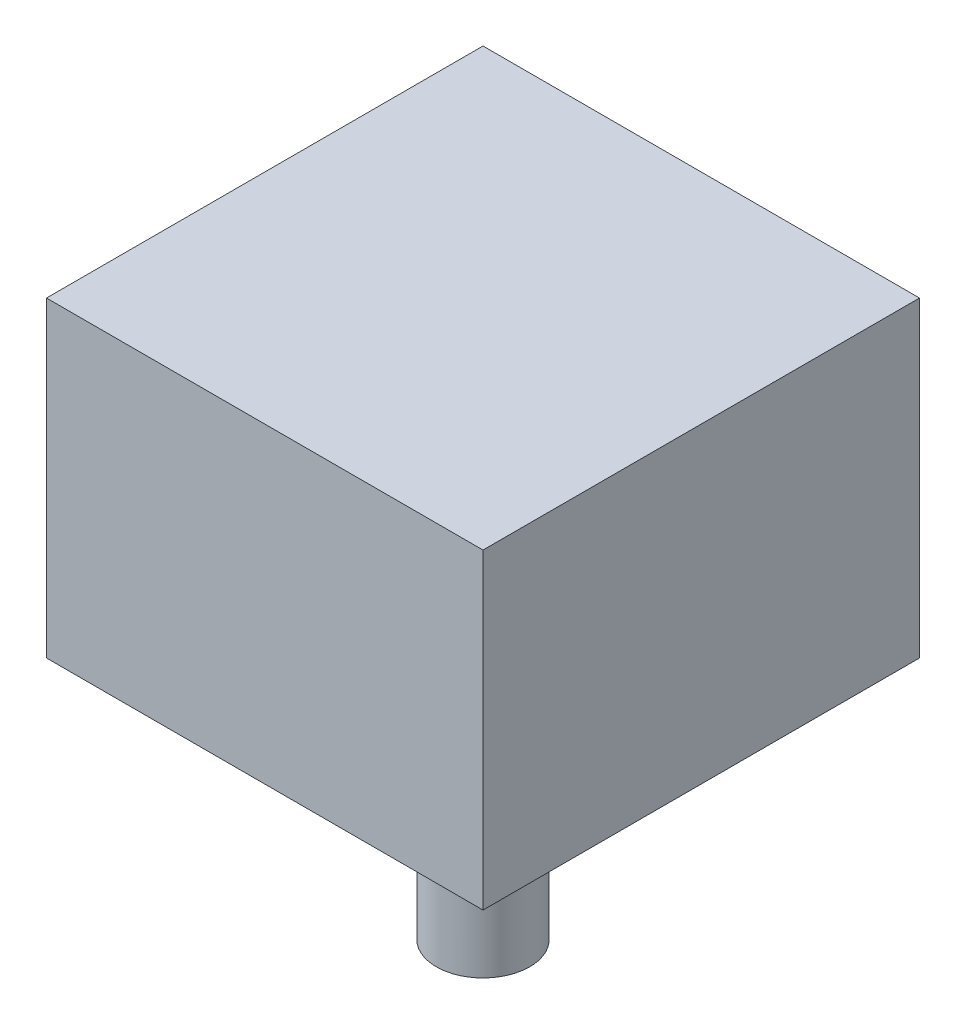
ISO-10303-21;
HEADER;
FILE_DESCRIPTION(('STEP AP214'),'2;1');
FILE_NAME('part.step','',(''),(''),'','','');
FILE_SCHEMA(('AUTOMOTIVE_DESIGN { 1 0 10303 214 1 1 1 1 }'));
ENDSEC;
DATA;
#1=APPLICATION_CONTEXT('core data for automotive mechanical design processes');
#2=APPLICATION_PROTOCOL_DEFINITION('international standard','automotive_design',2000,#1);
#3=PRODUCT_CONTEXT('',#1,'mechanical');
#4=PRODUCT('Part','Part','',(#3));
#5=PRODUCT_RELATED_PRODUCT_CATEGORY('part','',(#4));
#6=PRODUCT_DEFINITION_FORMATION('','',#4);
#7=PRODUCT_DEFINITION_CONTEXT('part definition',#1,'design');
#8=PRODUCT_DEFINITION('design','',#6,#7);
#9=PRODUCT_DEFINITION_SHAPE('','',#8);
#10=(LENGTH_UNIT() NAMED_UNIT(*) SI_UNIT(.MILLI.,.METRE.));
#11=(NAMED_UNIT(*) PLANE_ANGLE_UNIT() SI_UNIT($,.RADIAN.));
#12=(NAMED_UNIT(*) SI_UNIT($,.STERADIAN.) SOLID_ANGLE_UNIT());
#13=UNCERTAINTY_MEASURE_WITH_UNIT(LENGTH_MEASURE(1.E-05),#10,'distance_accuracy_value','');
#14=(GEOMETRIC_REPRESENTATION_CONTEXT(3) GLOBAL_UNCERTAINTY_ASSIGNED_CONTEXT((#13)) GLOBAL_UNIT_ASSIGNED_CONTEXT((#10,
#11,#12)) REPRESENTATION_CONTEXT('',''));
#15=CARTESIAN_POINT('',(0.,0.,0.));
#16=DIRECTION('',(0.,0.,1.));
#17=DIRECTION('',(1.,0.,0.));
#18=AXIS2_PLACEMENT_3D('',#15,#16,#17);
#19=CARTESIAN_POINT('',(0.,-8.,0.));
#20=DIRECTION('',(0.,-1.,0.));
#21=DIRECTION('',(1.,0.,0.));
#22=AXIS2_PLACEMENT_3D('',#19,#20,#21);
#23=SPHERICAL_SURFACE('',#22,6.4);
#24=CARTESIAN_POINT('',(0.,-13.653317610041,0.));
#25=DIRECTION('',(0.,-1.,0.));
#26=DIRECTION('',(0.,0.,-1.));
#27=AXIS2_PLACEMENT_3D('',#24,#25,#26);
#28=CIRCLE('',#27,3.);
#29=CARTESIAN_POINT('',(0.,-13.653317610041,-3.));
#30=VERTEX_POINT('',#29);
#31=EDGE_CURVE('E60',#30,#30,#28,.T.);
#32=ORIENTED_EDGE('',*,*,#31,.F.);
#33=EDGE_LOOP('',(#32));
#34=FACE_BOUND('',#33,.T.);
#35=ADVANCED_FACE('F48',(#34),#23,.T.);
#36=CARTESIAN_POINT('',(0.,-25.653317610041,0.));
#37=DIRECTION('',(0.,-1.,0.));
#38=DIRECTION('',(0.,0.,-1.));
#39=AXIS2_PLACEMENT_3D('',#36,#37,#38);
#40=PLANE('',#39);
#41=CARTESIAN_POINT('',(0.,-25.653317610041,0.));
#42=DIRECTION('',(0.,-1.,0.));
#43=DIRECTION('',(0.,0.,-1.));
#44=AXIS2_PLACEMENT_3D('',#41,#42,#43);
#45=CIRCLE('',#44,3.);
#46=CARTESIAN_POINT('',(0.,-25.653317610041,-3.));
#47=VERTEX_POINT('',#46);
#48=EDGE_CURVE('E11',#47,#47,#45,.T.);
#49=ORIENTED_EDGE('',*,*,#48,.T.);
#50=EDGE_LOOP('',(#49));
#51=FACE_BOUND('',#50,.T.);
#52=ADVANCED_FACE('F82',(#51),#40,.T.);
#53=CARTESIAN_POINT('',(0.,-15.,0.));
#54=DIRECTION('',(0.,-1.,0.));
#55=DIRECTION('',(0.,0.,-1.));
#56=AXIS2_PLACEMENT_3D('',#53,#54,#55);
#57=CYLINDRICAL_SURFACE('',#56,3.);
#58=CARTESIAN_POINT('',(0.,-16.103317610041,-3.));
#59=CARTESIAN_POINT('',(0.0811571910938377,-16.103322868141,-2.99999537089788));
#60=CARTESIAN_POINT('',(0.16240120517588,-16.1097289395545,-2.99667198613769));
#61=CARTESIAN_POINT('',(0.322467237501783,-16.1350599971728,-2.98370448048951));
#62=CARTESIAN_POINT('',(0.401284825199774,-16.1540066096197,-2.9740494408884));
#63=CARTESIAN_POINT('',(0.553942541484701,-16.2034692765506,-2.94942426610681));
#64=CARTESIAN_POINT('',(0.627801076270518,-16.233939403429,-2.9344752452331));
#65=CARTESIAN_POINT('',(0.769236589542657,-16.3053350234405,-2.90061565038481));
#66=CARTESIAN_POINT('',(0.836813795276095,-16.3462601381301,-2.88170521980747));
#67=CARTESIAN_POINT('',(0.968580906882855,-16.4403404079851,-2.84023220948414));
#68=CARTESIAN_POINT('',(1.03228532788197,-16.4941059159741,-2.81751418971712));
#69=CARTESIAN_POINT('',(1.15022482176075,-16.6110185822633,-2.77146151785461));
#70=CARTESIAN_POINT('',(1.20445215024937,-16.6741733359045,-2.74812637922862));
#71=CARTESIAN_POINT('',(1.30648923081014,-16.8144349240809,-2.70120330313405));
#72=CARTESIAN_POINT('',(1.35337394091069,-16.8922688283617,-2.67775957207618));
#73=CARTESIAN_POINT('',(1.43319211235935,-17.0560403432439,-2.63590673492171));
#74=CARTESIAN_POINT('',(1.4661359906984,-17.1419718441713,-2.61749387327315));
#75=CARTESIAN_POINT('',(1.51491639840249,-17.3141578461869,-2.58955215608188));
#76=CARTESIAN_POINT('',(1.53167906402741,-17.4000686049195,-2.57954726765548));
#77=CARTESIAN_POINT('',(1.5504322336963,-17.5740158801543,-2.56832510020633));
#78=CARTESIAN_POINT('',(1.55243922221982,-17.6620499142261,-2.56709801499814));
#79=CARTESIAN_POINT('',(1.54230129742961,-17.8254323219932,-2.57319253317738));
#80=CARTESIAN_POINT('',(1.53196008446953,-17.9009436477359,-2.57942483011358));
#81=CARTESIAN_POINT('',(1.50056578834274,-18.048954218708,-2.59781254539799));
#82=CARTESIAN_POINT('',(1.47950888000057,-18.1214523783261,-2.6099700788088));
#83=CARTESIAN_POINT('',(1.42692348053688,-18.2634472610811,-2.63909184292093));
#84=CARTESIAN_POINT('',(1.39516499725198,-18.3328364096341,-2.65616032364527));
#85=CARTESIAN_POINT('',(1.32226003328843,-18.4656437114367,-2.6931948900567));
#86=CARTESIAN_POINT('',(1.28110933978834,-18.5290591671334,-2.71316227456326));
#87=CARTESIAN_POINT('',(1.18404201316546,-18.6572393494268,-2.75703642460624));
#88=CARTESIAN_POINT('',(1.12687615066993,-18.7210048286204,-2.78110870294602));
#89=CARTESIAN_POINT('',(1.00260342432817,-18.8384767561711,-2.8282866964176));
#90=CARTESIAN_POINT('',(0.935491212511122,-18.892177757646,-2.85139188293745));
#91=CARTESIAN_POINT('',(0.788777791303168,-18.9906787708916,-2.89551258123171));
#92=CARTESIAN_POINT('',(0.708704849471569,-19.0348606853737,-2.91635383715829));
#93=CARTESIAN_POINT('',(0.540916699103983,-19.1087528594745,-2.95207406352636));
#94=CARTESIAN_POINT('',(0.453208011588538,-19.1384753274437,-2.96695806189017));
#95=CARTESIAN_POINT('',(0.280760113824296,-19.1800288551139,-2.98798539660305));
#96=CARTESIAN_POINT('',(0.196419524160747,-19.193184317482,-2.99477304114119));
#97=CARTESIAN_POINT('',(0.0264689022377674,-19.2054277394938,-3.0010855932881));
#98=CARTESIAN_POINT('',(-0.0591404421617319,-19.2045230618676,-3.00061430211088));
#99=CARTESIAN_POINT('',(-0.221539739201024,-19.1893873291257,-2.9928209898369));
#100=CARTESIAN_POINT('',(-0.298466661716923,-19.176281587065,-2.98607750557626));
#101=CARTESIAN_POINT('',(-0.448859357796647,-19.1389253574439,-2.96719922421109));
#102=CARTESIAN_POINT('',(-0.52232475993346,-19.1146736768943,-2.95506384999814));
#103=CARTESIAN_POINT('',(-0.666024635549229,-19.0551468665829,-2.92607802762268));
#104=CARTESIAN_POINT('',(-0.736118511927177,-19.0195920454011,-2.90910922874944));
#105=CARTESIAN_POINT('',(-0.869563703611751,-18.9387944126471,-2.87204849519176));
#106=CARTESIAN_POINT('',(-0.9329122337994,-18.893547622354,-2.85195527881111));
#107=CARTESIAN_POINT('',(-1.05800428540772,-18.7892852152656,-2.80810596771983));
#108=CARTESIAN_POINT('',(-1.11890926475951,-18.7293310803752,-2.78418580334275));
#109=CARTESIAN_POINT('',(-1.23019970538266,-18.6000960362657,-2.73683648190065));
#110=CARTESIAN_POINT('',(-1.28057666580067,-18.5308076637797,-2.71340773525694));
#111=CARTESIAN_POINT('',(-1.37215429643325,-18.3798980785479,-2.66832311402417));
#112=CARTESIAN_POINT('',(-1.41266019174362,-18.297796643362,-2.64684681378419));
#113=CARTESIAN_POINT('',(-1.4788525492711,-18.1264942199134,-2.61044850074907));
#114=CARTESIAN_POINT('',(-1.50455924389598,-18.0373031150279,-2.59551754632325));
#115=CARTESIAN_POINT('',(-1.53795658358956,-17.8636214412721,-2.57585561622635));
#116=CARTESIAN_POINT('',(-1.54716011229659,-17.7795211198746,-2.57027169154));
#117=CARTESIAN_POINT('',(-1.55170937850173,-17.6108272419549,-2.56753016065378));
#118=CARTESIAN_POINT('',(-1.54706263561229,-17.5262339779527,-2.57036798210188));
#119=CARTESIAN_POINT('',(-1.52547998823504,-17.3686237400016,-2.58322181370144));
#120=CARTESIAN_POINT('',(-1.50992456690369,-17.295342746505,-2.59243003353327));
#121=CARTESIAN_POINT('',(-1.46875628196533,-17.1525373265226,-2.61597283092195));
#122=CARTESIAN_POINT('',(-1.4431399785158,-17.0830141941182,-2.63030916164385));
#123=CARTESIAN_POINT('',(-1.38069574346861,-16.9445682389823,-2.66364552397914));
#124=CARTESIAN_POINT('',(-1.34323674576593,-16.8759912418904,-2.68289185984041));
#125=CARTESIAN_POINT('',(-1.25883212591263,-16.7456402412296,-2.72351522679164));
#126=CARTESIAN_POINT('',(-1.21188143318073,-16.6838699012284,-2.7448933936258));
#127=CARTESIAN_POINT('',(-1.10252915226198,-16.5603374638484,-2.79076888465928));
#128=CARTESIAN_POINT('',(-1.03890355388211,-16.499666638678,-2.81530328538766));
#129=CARTESIAN_POINT('',(-0.901768578594902,-16.3895750114482,-2.86217781867697));
#130=CARTESIAN_POINT('',(-0.828253434745607,-16.3401608191545,-2.88451665767506));
#131=CARTESIAN_POINT('',(-0.671719725833228,-16.2535272476479,-2.9249654101906));
#132=CARTESIAN_POINT('',(-0.588575023094196,-16.216502147391,-2.94300677813279));
#133=CARTESIAN_POINT('',(-0.416117662102291,-16.1574563372562,-2.9722779049624));
#134=CARTESIAN_POINT('',(-0.326822800067342,-16.1353941863057,-2.9835264675003));
#135=CARTESIAN_POINT('',(-0.197111591221045,-16.1153928502172,-2.99377574755927));
#136=CARTESIAN_POINT('',(-0.157869893981269,-16.110872027934,-2.99610282114016));
#137=CARTESIAN_POINT('',(-0.0790923446110308,-16.1048330898228,-2.99921609427244));
#138=CARTESIAN_POINT('',(-0.0395564853315007,-16.1033150472126,-3.00000225625121));
#139=CARTESIAN_POINT('',(0.,-16.103317610041,-3.));
#140=B_SPLINE_CURVE_WITH_KNOTS('',3,(#58,#59,#60,#61,#62,#63,#64,#65,#66,#67,#68,#69,#70,#71,
#72,#73,#74,#75,#76,#77,#78,#79,#80,#81,#82,#83,#84,#85,#86,#87,#88,#89,#90,#91,#92,#93,#94,#95,
#96,#97,#98,#99,#100,#101,#102,#103,#104,#105,#106,#107,#108,#109,#110,#111,#112,#113,#114,#115,
#116,#117,#118,#119,#120,#121,#122,#123,#124,#125,#126,#127,#128,#129,#130,#131,#132,#133,#134,
#135,#136,#137,#138,#139),.UNSPECIFIED.,.T.,.F.,(4,2,2,2,2,2,2,2,2,2,2,2,2,2,2,2,2,2,2,2,2,2,2,
2,2,2,2,2,2,2,2,2,2,2,2,2,2,2,2,2,4),(0.,0.243311545013475,0.487043779368091,0.729814671205952,
0.972576776611061,1.23071170610758,1.48905659919067,1.76915795006661,2.04904962997784,
2.31175720064009,2.57417123976732,2.80251243731576,3.03093520292359,3.26461853987062,
3.49840690083491,3.76413445854403,4.03000541498387,4.30988543134837,4.58952872847072,
4.84500071457372,5.10033892477694,5.33423793340262,5.56816198289844,5.80839566718477,
6.0487281612101,6.31383394548568,6.57915296946552,6.8597381050212,7.13993872810776,
7.39280485418765,7.64553371878147,7.87098585035563,8.09651513181351,8.33700671665397,
8.57762711619527,8.85021371423122,9.12295996177135,9.39980216012753,9.6758744563321,
9.79446302206795,9.91305447935708),.UNSPECIFIED.);
#141=CARTESIAN_POINT('',(0.,-16.103317610041,-3.));
#142=VERTEX_POINT('',#141);
#143=EDGE_CURVE('E51',#142,#142,#140,.T.);
#144=ORIENTED_EDGE('',*,*,#143,.F.);
#145=EDGE_LOOP('',(#144));
#146=FACE_BOUND('',#145,.T.);
#147=CARTESIAN_POINT('',(1.55,-17.653317610041,2.56855990780827));
#148=CARTESIAN_POINT('',(1.54999407109245,-17.5729772673291,2.56856758763115));
#149=CARTESIAN_POINT('',(1.54371135922679,-17.4925452104246,2.57238737620073));
#150=CARTESIAN_POINT('',(1.51891671673704,-17.3341844313511,2.58709992521849));
#151=CARTESIAN_POINT('',(1.50038081787188,-17.2562609300432,2.59800654738096));
#152=CARTESIAN_POINT('',(1.45211552860033,-17.1055116039471,2.62528412383222));
#153=CARTESIAN_POINT('',(1.42244885556849,-17.0326598789221,2.64162440408012));
#154=CARTESIAN_POINT('',(1.35295628441986,-16.8929879004758,2.67787992722966));
#155=CARTESIAN_POINT('',(1.31312926854181,-16.8261683117585,2.69779556339244));
#156=CARTESIAN_POINT('',(1.22032197800243,-16.693941959088,2.74110531727558));
#157=CARTESIAN_POINT('',(1.16649013086066,-16.6291823735859,2.76465130044681));
#158=CARTESIAN_POINT('',(1.04896817557422,-16.5091022068992,2.81134587456851));
#159=CARTESIAN_POINT('',(0.985272888962598,-16.4537866162262,2.83449424963512));
#160=CARTESIAN_POINT('',(0.844142015762803,-16.3501943394916,2.87980949206863));
#161=CARTESIAN_POINT('',(0.766042002654875,-16.3027290596355,2.90178054660839));
#162=CARTESIAN_POINT('',(0.601616567282121,-16.2219086663453,2.94026618916116));
#163=CARTESIAN_POINT('',(0.515296729940618,-16.1885440549167,2.95678444844664));
#164=CARTESIAN_POINT('',(0.343751425344186,-16.1394866583178,2.98140398435746));
#165=CARTESIAN_POINT('',(0.258930938090316,-16.1226545519336,2.99004437442712));
#166=CARTESIAN_POINT('',(0.0872652452120798,-16.1033722511965,2.99995965106026));
#167=CARTESIAN_POINT('',(0.00042139864906458,-16.1009126675754,3.00123934620302));
#168=CARTESIAN_POINT('',(-0.164194325558729,-16.1100415859951,2.99653017783555));
#169=CARTESIAN_POINT('',(-0.242060863657692,-16.1203488954343,2.99120414963753));
#170=CARTESIAN_POINT('',(-0.39477526047954,-16.152404363986,2.97490343836279));
#171=CARTESIAN_POINT('',(-0.469622891353697,-16.1741533849161,2.96392832978495));
#172=CARTESIAN_POINT('',(-0.615423392470293,-16.2285748655874,2.93714577929528));
#173=CARTESIAN_POINT('',(-0.686312903663804,-16.2613857925872,2.92127731120307));
#174=CARTESIAN_POINT('',(-0.821742168129232,-16.3367867815092,2.88611193920134));
#175=CARTESIAN_POINT('',(-0.886279697925966,-16.3793802504858,2.86681384135456));
#176=CARTESIAN_POINT('',(-1.01400407671659,-16.4779735073766,2.82431625347965));
#177=CARTESIAN_POINT('',(-1.07642304241976,-16.5348836363444,2.80091965725316));
#178=CARTESIAN_POINT('',(-1.19125978704577,-16.6580783362283,2.75404340345798));
#179=CARTESIAN_POINT('',(-1.24366896925665,-16.7243708807514,2.73056369197504));
#180=CARTESIAN_POINT('',(-1.34067598541859,-16.8701905100716,2.68433935057199));
#181=CARTESIAN_POINT('',(-1.38445282790692,-16.9503236137333,2.66176585737562));
#182=CARTESIAN_POINT('',(-1.45758159270671,-17.1182322887511,2.62244082990642));
#183=CARTESIAN_POINT('',(-1.48694930991728,-17.2059993670958,2.60568292666568));
#184=CARTESIAN_POINT('',(-1.52796614090751,-17.3792889104685,2.58182970365164));
#185=CARTESIAN_POINT('',(-1.54085224706871,-17.46442243988,2.57406462933597));
#186=CARTESIAN_POINT('',(-1.55227925919939,-17.6359665465933,2.56719372521464));
#187=CARTESIAN_POINT('',(-1.55083201076113,-17.7223760104494,2.56808074500257));
#188=CARTESIAN_POINT('',(-1.53476867977678,-17.8828750100118,2.57770145969976));
#189=CARTESIAN_POINT('',(-1.5217622123245,-17.9571933036838,2.58547570331481));
#190=CARTESIAN_POINT('',(-1.4853972952245,-18.1024304275551,2.60653659420377));
#191=CARTESIAN_POINT('',(-1.46203517760044,-18.1733480433607,2.61982519455895));
#192=CARTESIAN_POINT('',(-1.40452444849724,-18.313476874366,2.65111755303424));
#193=CARTESIAN_POINT('',(-1.36993220782627,-18.3824624900824,2.66930882951019));
#194=CARTESIAN_POINT('',(-1.29132141669978,-18.5140561069428,2.7082118952703));
#195=CARTESIAN_POINT('',(-1.24729801391975,-18.5766608005461,2.72892497964523));
#196=CARTESIAN_POINT('',(-1.14406942423122,-18.7026551644934,2.77392991563014));
#197=CARTESIAN_POINT('',(-1.08361254709366,-18.76498741218,2.79832457859212));
#198=CARTESIAN_POINT('',(-0.952771318472118,-18.8789840595197,2.84553409763735));
#199=CARTESIAN_POINT('',(-0.882382884381673,-18.9306440504555,2.86834829825402));
#200=CARTESIAN_POINT('',(-0.730528288923955,-19.0233531867568,2.91079728556098));
#201=CARTESIAN_POINT('',(-0.648769911698114,-19.0639886601364,2.93029988061539));
#202=CARTESIAN_POINT('',(-0.478280121236612,-19.1305105212262,2.96289604969122));
#203=CARTESIAN_POINT('',(-0.389555315148682,-19.1564106965126,2.97599561330176));
#204=CARTESIAN_POINT('',(-0.216791982566539,-19.1903593970293,2.99329389211888));
#205=CARTESIAN_POINT('',(-0.13311492049112,-19.1998763405463,2.99822306876511));
#206=CARTESIAN_POINT('',(0.0347780939831528,-19.2051987893894,3.00097103355683));
#207=CARTESIAN_POINT('',(0.118993816573317,-19.201009797313,2.99879267520451));
#208=CARTESIAN_POINT('',(0.279050183963372,-19.1799704377466,2.98799243472545));
#209=CARTESIAN_POINT('',(0.355052230531946,-19.1640706882262,2.97985458335338));
#210=CARTESIAN_POINT('',(0.503165342164941,-19.1214003109292,2.95845010729966));
#211=CARTESIAN_POINT('',(0.575275881921464,-19.0946282196513,2.94518279216408));
#212=CARTESIAN_POINT('',(0.716866547546158,-19.0298745932894,2.91403017134419));
#213=CARTESIAN_POINT('',(0.7861213167482,-18.9914824068124,2.89597937073075));
#214=CARTESIAN_POINT('',(0.91747704147612,-18.9050857544384,2.85708525970917));
#215=CARTESIAN_POINT('',(0.979574760181063,-18.8570769660376,2.83624069494933));
#216=CARTESIAN_POINT('',(1.10175313447835,-18.7469789266154,2.79120242805909));
#217=CARTESIAN_POINT('',(1.16093514660659,-18.6839399345929,2.76688703009447));
#218=CARTESIAN_POINT('',(1.26825247015974,-18.5485840487987,2.71937285599714));
#219=CARTESIAN_POINT('',(1.31637683220899,-18.4762580684726,2.6961752044712));
#220=CARTESIAN_POINT('',(1.40202611396712,-18.3204439373879,2.65268352260283));
#221=CARTESIAN_POINT('',(1.439016674449,-18.2366130752885,2.6325537877284));
#222=CARTESIAN_POINT('',(1.49779119293291,-18.0625743606906,2.59957382501019));
#223=CARTESIAN_POINT('',(1.51962562830278,-17.9723887888848,2.5866994604253));
#224=CARTESIAN_POINT('',(1.53880267262315,-17.8431514371448,2.57528987108191));
#225=CARTESIAN_POINT('',(1.54299409011397,-17.8053588234053,2.57277665675291));
#226=CARTESIAN_POINT('',(1.54859424707795,-17.729490229091,2.56940980204655));
#227=CARTESIAN_POINT('',(1.55000281143116,-17.6914142308347,2.56855626610983));
#228=CARTESIAN_POINT('',(1.55,-17.653317610041,2.56855990780827));
#229=B_SPLINE_CURVE_WITH_KNOTS('',3,(#147,#148,#149,#150,#151,#152,#153,#154,#155,#156,#157,
#158,#159,#160,#161,#162,#163,#164,#165,#166,#167,#168,#169,#170,#171,#172,#173,#174,#175,#176,
#177,#178,#179,#180,#181,#182,#183,#184,#185,#186,#187,#188,#189,#190,#191,#192,#193,#194,#195,
#196,#197,#198,#199,#200,#201,#202,#203,#204,#205,#206,#207,#208,#209,#210,#211,#212,#213,#214,
#215,#216,#217,#218,#219,#220,#221,#222,#223,#224,#225,#226,#227,#228),.UNSPECIFIED.,.T.,.F.,(4,
2,2,2,2,2,2,2,2,2,2,2,2,2,2,2,2,2,2,2,2,2,2,2,2,2,2,2,2,2,2,2,2,2,2,2,2,2,2,2,4),(0.,
0.240860404934378,0.48219335230399,0.722186424528839,0.962205910303522,1.2234452790249,
1.48482227062786,1.76532798576229,2.04564445422735,2.30490154317004,2.56398924593493,
2.7990581657298,3.03414479402262,3.27229068379531,3.51051964090497,3.7723607934912,
4.03442582200953,4.31513509274971,4.59553596615625,4.85334395290183,5.11093889578024,
5.33746018243238,5.56406176722676,5.80100537313768,6.03807118035938,6.30746891746102,
6.57697772141108,6.8555195369389,7.13380029500913,7.38550951502228,7.63711769235047,
7.87028238079253,8.1034784654127,8.34613400201953,8.58889885402428,8.85718985782794,
9.12574539156814,9.40565889084488,9.68463560847094,9.79884211828697,9.91305581468468),.UNSPECIFIED.);
#230=CARTESIAN_POINT('',(1.55,-17.653317610041,2.56855990780827));
#231=VERTEX_POINT('',#230);
#232=EDGE_CURVE('E66',#231,#231,#229,.T.);
#233=ORIENTED_EDGE('',*,*,#232,.F.);
#234=EDGE_LOOP('',(#233));
#235=FACE_BOUND('',#234,.T.);
#236=ORIENTED_EDGE('',*,*,#31,.T.);
#237=EDGE_LOOP('',(#236));
#238=FACE_BOUND('',#237,.T.);
#239=ORIENTED_EDGE('',*,*,#48,.F.);
#240=EDGE_LOOP('',(#239));
#241=FACE_BOUND('',#240,.T.);
#242=ADVANCED_FACE('F71',(#146,#235,#238,#241),#57,.T.);
#243=CARTESIAN_POINT('',(0.,-17.653317610041,-14.));
#244=DIRECTION('',(0.,0.,1.));
#245=DIRECTION('',(1.,0.,0.));
#246=AXIS2_PLACEMENT_3D('',#243,#244,#245);
#247=CYLINDRICAL_SURFACE('',#246,1.55);
#248=ORIENTED_EDGE('',*,*,#143,.T.);
#249=EDGE_LOOP('',(#248));
#250=FACE_BOUND('',#249,.T.);
#251=ORIENTED_EDGE('',*,*,#232,.T.);
#252=EDGE_LOOP('',(#251));
#253=FACE_BOUND('',#252,.T.);
#254=ADVANCED_FACE('F73',(#250,#253),#247,.F.);
#255=CLOSED_SHELL('',(#35,#52,#242,#254));
#256=MANIFOLD_SOLID_BREP('B2',#255);
#257=CARTESIAN_POINT('',(-14.,-10.,-14.));
#258=DIRECTION('',(-1.,0.,0.));
#259=DIRECTION('',(0.,0.,1.));
#260=AXIS2_PLACEMENT_3D('',#257,#258,#259);
#261=PLANE('',#260);
#262=DIRECTION('',(0.,0.,1.));
#263=VECTOR('',#262,1.);
#264=CARTESIAN_POINT('',(-14.,10.,-14.));
#265=LINE('',#264,#263);
#266=CARTESIAN_POINT('',(-14.,10.,-14.));
#267=VERTEX_POINT('',#266);
#268=CARTESIAN_POINT('',(-14.,10.,14.));
#269=VERTEX_POINT('',#268);
#270=EDGE_CURVE('E192',#267,#269,#265,.T.);
#271=ORIENTED_EDGE('',*,*,#270,.F.);
#272=DIRECTION('',(0.,1.,0.));
#273=VECTOR('',#272,1.);
#274=CARTESIAN_POINT('',(-14.,-10.,-14.));
#275=LINE('',#274,#273);
#276=CARTESIAN_POINT('',(-14.,-10.,-14.));
#277=VERTEX_POINT('',#276);
#278=EDGE_CURVE('E46',#277,#267,#275,.T.);
#279=ORIENTED_EDGE('',*,*,#278,.F.);
#280=DIRECTION('',(0.,0.,1.));
#281=VECTOR('',#280,1.);
#282=CARTESIAN_POINT('',(-14.,-10.,-14.));
#283=LINE('',#282,#281);
#284=CARTESIAN_POINT('',(-14.,-10.,14.));
#285=VERTEX_POINT('',#284);
#286=EDGE_CURVE('E185',#277,#285,#283,.T.);
#287=ORIENTED_EDGE('',*,*,#286,.T.);
#288=DIRECTION('',(0.,1.,0.));
#289=VECTOR('',#288,1.);
#290=CARTESIAN_POINT('',(-14.,-10.,14.));
#291=LINE('',#290,#289);
#292=EDGE_CURVE('E161',#285,#269,#291,.T.);
#293=ORIENTED_EDGE('',*,*,#292,.T.);
#294=EDGE_LOOP('',(#271,#279,#287,#293));
#295=FACE_BOUND('',#294,.T.);
#296=ADVANCED_FACE('F119',(#295),#261,.T.);
#297=CARTESIAN_POINT('',(-14.,-10.,-14.));
#298=DIRECTION('',(0.,0.,1.));
#299=DIRECTION('',(1.,0.,0.));
#300=AXIS2_PLACEMENT_3D('',#297,#298,#299);
#301=PLANE('',#300);
#302=DIRECTION('',(1.,0.,0.));
#303=VECTOR('',#302,1.);
#304=CARTESIAN_POINT('',(-14.,10.,-14.));
#305=LINE('',#304,#303);
#306=CARTESIAN_POINT('',(14.,10.,-14.));
#307=VERTEX_POINT('',#306);
#308=EDGE_CURVE('E153',#267,#307,#305,.T.);
#309=ORIENTED_EDGE('',*,*,#308,.T.);
#310=DIRECTION('',(0.,1.,0.));
#311=VECTOR('',#310,1.);
#312=CARTESIAN_POINT('',(14.,-10.,-14.));
#313=LINE('',#312,#311);
#314=CARTESIAN_POINT('',(14.,-10.,-14.));
#315=VERTEX_POINT('',#314);
#316=EDGE_CURVE('E129',#315,#307,#313,.T.);
#317=ORIENTED_EDGE('',*,*,#316,.F.);
#318=DIRECTION('',(1.,0.,0.));
#319=VECTOR('',#318,1.);
#320=CARTESIAN_POINT('',(-14.,-10.,-14.));
#321=LINE('',#320,#319);
#322=EDGE_CURVE('E171',#277,#315,#321,.T.);
#323=ORIENTED_EDGE('',*,*,#322,.F.);
#324=ORIENTED_EDGE('',*,*,#278,.T.);
#325=EDGE_LOOP('',(#309,#317,#323,#324));
#326=FACE_BOUND('',#325,.T.);
#327=ADVANCED_FACE('F220',(#326),#301,.F.);
#328=CARTESIAN_POINT('',(14.,-10.,-14.));
#329=DIRECTION('',(-1.,0.,0.));
#330=DIRECTION('',(0.,0.,1.));
#331=AXIS2_PLACEMENT_3D('',#328,#329,#330);
#332=PLANE('',#331);
#333=DIRECTION('',(0.,0.,1.));
#334=VECTOR('',#333,1.);
#335=CARTESIAN_POINT('',(14.,10.,-14.));
#336=LINE('',#335,#334);
#337=CARTESIAN_POINT('',(14.,10.,14.));
#338=VERTEX_POINT('',#337);
#339=EDGE_CURVE('E179',#307,#338,#336,.T.);
#340=ORIENTED_EDGE('',*,*,#339,.T.);
#341=DIRECTION('',(0.,1.,0.));
#342=VECTOR('',#341,1.);
#343=CARTESIAN_POINT('',(14.,-10.,14.));
#344=LINE('',#343,#342);
#345=CARTESIAN_POINT('',(14.,-10.,14.));
#346=VERTEX_POINT('',#345);
#347=EDGE_CURVE('E176',#346,#338,#344,.T.);
#348=ORIENTED_EDGE('',*,*,#347,.F.);
#349=DIRECTION('',(0.,0.,1.));
#350=VECTOR('',#349,1.);
#351=CARTESIAN_POINT('',(14.,-10.,-14.));
#352=LINE('',#351,#350);
#353=EDGE_CURVE('E166',#315,#346,#352,.T.);
#354=ORIENTED_EDGE('',*,*,#353,.F.);
#355=ORIENTED_EDGE('',*,*,#316,.T.);
#356=EDGE_LOOP('',(#340,#348,#354,#355));
#357=FACE_BOUND('',#356,.T.);
#358=ADVANCED_FACE('F177',(#357),#332,.F.);
#359=CARTESIAN_POINT('',(-14.,-10.,14.));
#360=DIRECTION('',(0.,0.,1.));
#361=DIRECTION('',(1.,0.,0.));
#362=AXIS2_PLACEMENT_3D('',#359,#360,#361);
#363=PLANE('',#362);
#364=DIRECTION('',(1.,0.,0.));
#365=VECTOR('',#364,1.);
#366=CARTESIAN_POINT('',(-14.,10.,14.));
#367=LINE('',#366,#365);
#368=EDGE_CURVE('E196',#269,#338,#367,.T.);
#369=ORIENTED_EDGE('',*,*,#368,.F.);
#370=ORIENTED_EDGE('',*,*,#292,.F.);
#371=DIRECTION('',(1.,0.,0.));
#372=VECTOR('',#371,1.);
#373=CARTESIAN_POINT('',(-14.,-10.,14.));
#374=LINE('',#373,#372);
#375=EDGE_CURVE('E170',#285,#346,#374,.T.);
#376=ORIENTED_EDGE('',*,*,#375,.T.);
#377=ORIENTED_EDGE('',*,*,#347,.T.);
#378=EDGE_LOOP('',(#369,#370,#376,#377));
#379=FACE_BOUND('',#378,.T.);
#380=ADVANCED_FACE('F183',(#379),#363,.T.);
#381=CARTESIAN_POINT('',(0.,-10.,0.));
#382=DIRECTION('',(0.,1.,0.));
#383=DIRECTION('',(0.,0.,1.));
#384=AXIS2_PLACEMENT_3D('',#381,#382,#383);
#385=PLANE('',#384);
#386=CARTESIAN_POINT('',(0.,-10.,0.));
#387=DIRECTION('',(0.,1.,0.));
#388=DIRECTION('',(0.,0.,1.));
#389=AXIS2_PLACEMENT_3D('',#386,#387,#388);
#390=CIRCLE('',#389,6.70820393249937);
#391=CARTESIAN_POINT('',(0.,-10.,6.70820393249937));
#392=VERTEX_POINT('',#391);
#393=EDGE_CURVE('E122',#392,#392,#390,.T.);
#394=ORIENTED_EDGE('',*,*,#393,.T.);
#395=EDGE_LOOP('',(#394));
#396=FACE_BOUND('',#395,.T.);
#397=ORIENTED_EDGE('',*,*,#286,.F.);
#398=ORIENTED_EDGE('',*,*,#322,.T.);
#399=ORIENTED_EDGE('',*,*,#353,.T.);
#400=ORIENTED_EDGE('',*,*,#375,.F.);
#401=EDGE_LOOP('',(#397,#398,#399,#400));
#402=FACE_BOUND('',#401,.T.);
#403=ADVANCED_FACE('F169',(#396,#402),#385,.F.);
#404=CARTESIAN_POINT('',(0.,10.,0.));
#405=DIRECTION('',(0.,1.,0.));
#406=DIRECTION('',(0.,0.,1.));
#407=AXIS2_PLACEMENT_3D('',#404,#405,#406);
#408=PLANE('',#407);
#409=ORIENTED_EDGE('',*,*,#270,.T.);
#410=ORIENTED_EDGE('',*,*,#368,.T.);
#411=ORIENTED_EDGE('',*,*,#339,.F.);
#412=ORIENTED_EDGE('',*,*,#308,.F.);
#413=EDGE_LOOP('',(#409,#410,#411,#412));
#414=FACE_BOUND('',#413,.T.);
#415=ADVANCED_FACE('F206',(#414),#408,.T.);
#416=CARTESIAN_POINT('',(0.,-8.,0.));
#417=DIRECTION('',(0.,-1.,0.));
#418=DIRECTION('',(-1.,0.,0.));
#419=AXIS2_PLACEMENT_3D('',#416,#417,#418);
#420=SPHERICAL_SURFACE('',#419,7.);
#421=ORIENTED_EDGE('',*,*,#393,.F.);
#422=EDGE_LOOP('',(#421));
#423=FACE_BOUND('',#422,.T.);
#424=ADVANCED_FACE('F208',(#423),#420,.F.);
#425=CLOSED_SHELL('',(#296,#327,#358,#380,#403,#415,#424));
#426=MANIFOLD_SOLID_BREP('B6',#425);
#427=ADVANCED_BREP_SHAPE_REPRESENTATION('',(#18,#256,#426),#14);
#428=SHAPE_DEFINITION_REPRESENTATION(#9,#427);
ENDSEC;
END-ISO-10303-21;
